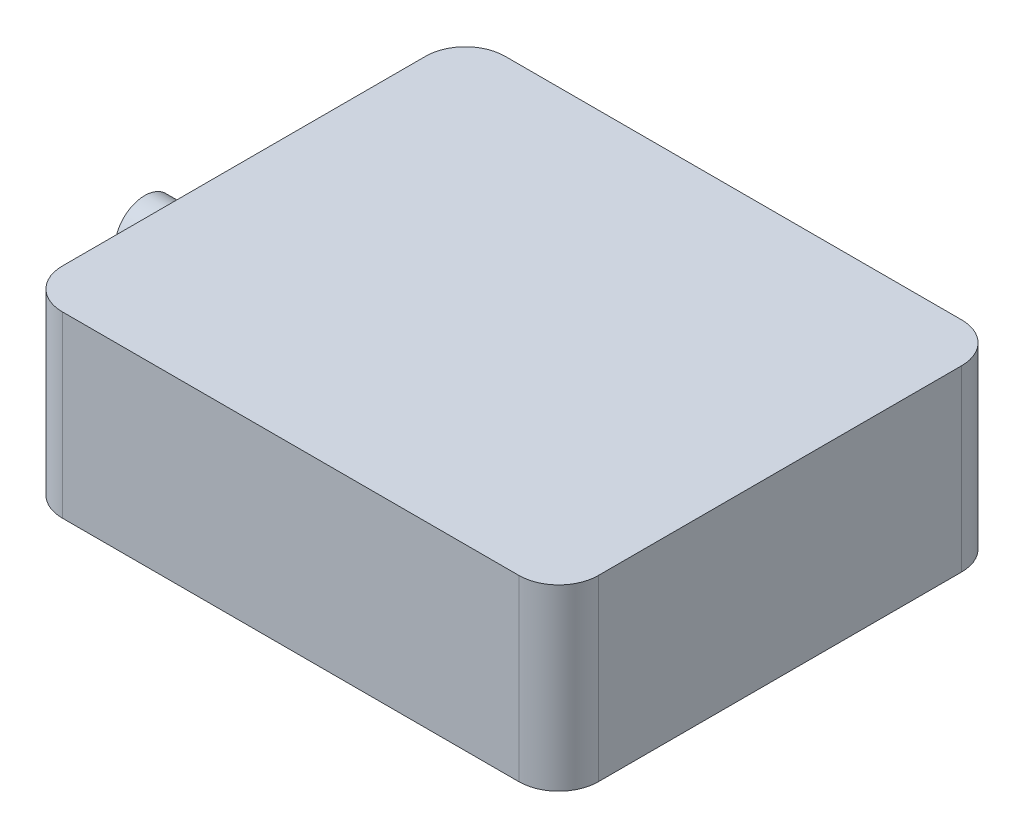
ISO-10303-21;
HEADER;
FILE_DESCRIPTION(('STEP AP214'),'2;1');
FILE_NAME('part.step','',(''),(''),'','','');
FILE_SCHEMA(('AUTOMOTIVE_DESIGN { 1 0 10303 214 1 1 1 1 }'));
ENDSEC;
DATA;
#1=APPLICATION_CONTEXT('core data for automotive mechanical design processes');
#2=APPLICATION_PROTOCOL_DEFINITION('international standard','automotive_design',2000,#1);
#3=PRODUCT_CONTEXT('',#1,'mechanical');
#4=PRODUCT('Part','Part','',(#3));
#5=PRODUCT_RELATED_PRODUCT_CATEGORY('part','',(#4));
#6=PRODUCT_DEFINITION_FORMATION('','',#4);
#7=PRODUCT_DEFINITION_CONTEXT('part definition',#1,'design');
#8=PRODUCT_DEFINITION('design','',#6,#7);
#9=PRODUCT_DEFINITION_SHAPE('','',#8);
#10=(LENGTH_UNIT() NAMED_UNIT(*) SI_UNIT(.MILLI.,.METRE.));
#11=(NAMED_UNIT(*) PLANE_ANGLE_UNIT() SI_UNIT($,.RADIAN.));
#12=(NAMED_UNIT(*) SI_UNIT($,.STERADIAN.) SOLID_ANGLE_UNIT());
#13=UNCERTAINTY_MEASURE_WITH_UNIT(LENGTH_MEASURE(1.E-05),#10,'distance_accuracy_value','');
#14=(GEOMETRIC_REPRESENTATION_CONTEXT(3) GLOBAL_UNCERTAINTY_ASSIGNED_CONTEXT((#13)) GLOBAL_UNIT_ASSIGNED_CONTEXT((#10,
#11,#12)) REPRESENTATION_CONTEXT('',''));
#15=CARTESIAN_POINT('',(0.,0.,0.));
#16=DIRECTION('',(0.,0.,1.));
#17=DIRECTION('',(1.,0.,0.));
#18=AXIS2_PLACEMENT_3D('',#15,#16,#17);
#19=CARTESIAN_POINT('',(13.5,9.,11.15));
#20=DIRECTION('',(-1.,0.,0.));
#21=DIRECTION('',(0.,0.,1.));
#22=AXIS2_PLACEMENT_3D('',#19,#20,#21);
#23=PLANE('',#22);
#24=DIRECTION('',(0.,0.,-1.));
#25=VECTOR('',#24,1.);
#26=CARTESIAN_POINT('',(13.5,0.,11.15));
#27=LINE('',#26,#25);
#28=CARTESIAN_POINT('',(13.5,0.,9.15));
#29=VERTEX_POINT('',#28);
#30=CARTESIAN_POINT('',(13.5,0.,-9.15));
#31=VERTEX_POINT('',#30);
#32=EDGE_CURVE('E142',#29,#31,#27,.T.);
#33=ORIENTED_EDGE('',*,*,#32,.T.);
#34=DIRECTION('',(0.,-1.,0.));
#35=VECTOR('',#34,1.);
#36=CARTESIAN_POINT('',(13.5,9.,-9.15));
#37=LINE('',#36,#35);
#38=CARTESIAN_POINT('',(13.5,9.,-9.15));
#39=VERTEX_POINT('',#38);
#40=EDGE_CURVE('E117',#31,#39,#37,.F.);
#41=ORIENTED_EDGE('',*,*,#40,.T.);
#42=DIRECTION('',(0.,0.,-1.));
#43=VECTOR('',#42,1.);
#44=CARTESIAN_POINT('',(13.5,9.,11.15));
#45=LINE('',#44,#43);
#46=CARTESIAN_POINT('',(13.5,9.,9.15));
#47=VERTEX_POINT('',#46);
#48=EDGE_CURVE('E155',#47,#39,#45,.T.);
#49=ORIENTED_EDGE('',*,*,#48,.F.);
#50=DIRECTION('',(0.,-1.,0.));
#51=VECTOR('',#50,1.);
#52=CARTESIAN_POINT('',(13.5,9.,9.15));
#53=LINE('',#52,#51);
#54=EDGE_CURVE('E123',#47,#29,#53,.T.);
#55=ORIENTED_EDGE('',*,*,#54,.T.);
#56=EDGE_LOOP('',(#33,#41,#49,#55));
#57=FACE_BOUND('',#56,.T.);
#58=ADVANCED_FACE('F45',(#57),#23,.F.);
#59=CARTESIAN_POINT('',(-13.5,9.,-11.15));
#60=DIRECTION('',(0.,0.,1.));
#61=DIRECTION('',(1.,0.,0.));
#62=AXIS2_PLACEMENT_3D('',#59,#60,#61);
#63=PLANE('',#62);
#64=DIRECTION('',(-1.,0.,0.));
#65=VECTOR('',#64,1.);
#66=CARTESIAN_POINT('',(-13.5,9.,-11.15));
#67=LINE('',#66,#65);
#68=CARTESIAN_POINT('',(11.5,9.,-11.15));
#69=VERTEX_POINT('',#68);
#70=CARTESIAN_POINT('',(-11.5,9.,-11.15));
#71=VERTEX_POINT('',#70);
#72=EDGE_CURVE('E133',#69,#71,#67,.T.);
#73=ORIENTED_EDGE('',*,*,#72,.F.);
#74=DIRECTION('',(0.,-1.,0.));
#75=VECTOR('',#74,1.);
#76=CARTESIAN_POINT('',(11.5,9.,-11.15));
#77=LINE('',#76,#75);
#78=CARTESIAN_POINT('',(11.5,0.,-11.15));
#79=VERTEX_POINT('',#78);
#80=EDGE_CURVE('E116',#69,#79,#77,.T.);
#81=ORIENTED_EDGE('',*,*,#80,.T.);
#82=DIRECTION('',(-1.,0.,0.));
#83=VECTOR('',#82,1.);
#84=CARTESIAN_POINT('',(-13.5,0.,-11.15));
#85=LINE('',#84,#83);
#86=CARTESIAN_POINT('',(-11.5,0.,-11.15));
#87=VERTEX_POINT('',#86);
#88=EDGE_CURVE('E130',#79,#87,#85,.T.);
#89=ORIENTED_EDGE('',*,*,#88,.T.);
#90=DIRECTION('',(0.,-1.,0.));
#91=VECTOR('',#90,1.);
#92=CARTESIAN_POINT('',(-11.5,9.,-11.15));
#93=LINE('',#92,#91);
#94=EDGE_CURVE('E136',#87,#71,#93,.F.);
#95=ORIENTED_EDGE('',*,*,#94,.T.);
#96=EDGE_LOOP('',(#73,#81,#89,#95));
#97=FACE_BOUND('',#96,.T.);
#98=ADVANCED_FACE('F129',(#97),#63,.F.);
#99=CARTESIAN_POINT('',(-13.5,9.,11.15));
#100=DIRECTION('',(1.,0.,0.));
#101=DIRECTION('',(0.,0.,-1.));
#102=AXIS2_PLACEMENT_3D('',#99,#100,#101);
#103=PLANE('',#102);
#104=CARTESIAN_POINT('',(-13.5,3.5,0.));
#105=DIRECTION('',(1.,0.,0.));
#106=DIRECTION('',(0.,0.,-1.));
#107=AXIS2_PLACEMENT_3D('',#104,#105,#106);
#108=CIRCLE('',#107,1.5);
#109=CARTESIAN_POINT('',(-13.5,3.5,-1.5));
#110=VERTEX_POINT('',#109);
#111=EDGE_CURVE('E156',#110,#110,#108,.F.);
#112=ORIENTED_EDGE('',*,*,#111,.F.);
#113=EDGE_LOOP('',(#112));
#114=FACE_BOUND('',#113,.T.);
#115=DIRECTION('',(0.,0.,1.));
#116=VECTOR('',#115,1.);
#117=CARTESIAN_POINT('',(-13.5,0.,11.15));
#118=LINE('',#117,#116);
#119=CARTESIAN_POINT('',(-13.5,0.,-9.15));
#120=VERTEX_POINT('',#119);
#121=CARTESIAN_POINT('',(-13.5,0.,9.15));
#122=VERTEX_POINT('',#121);
#123=EDGE_CURVE('E141',#120,#122,#118,.T.);
#124=ORIENTED_EDGE('',*,*,#123,.T.);
#125=DIRECTION('',(0.,-1.,0.));
#126=VECTOR('',#125,1.);
#127=CARTESIAN_POINT('',(-13.5,9.,9.15));
#128=LINE('',#127,#126);
#129=CARTESIAN_POINT('',(-13.5,9.,9.15));
#130=VERTEX_POINT('',#129);
#131=EDGE_CURVE('E11',#122,#130,#128,.F.);
#132=ORIENTED_EDGE('',*,*,#131,.T.);
#133=DIRECTION('',(0.,0.,1.));
#134=VECTOR('',#133,1.);
#135=CARTESIAN_POINT('',(-13.5,9.,11.15));
#136=LINE('',#135,#134);
#137=CARTESIAN_POINT('',(-13.5,9.,-9.15));
#138=VERTEX_POINT('',#137);
#139=EDGE_CURVE('E198',#138,#130,#136,.T.);
#140=ORIENTED_EDGE('',*,*,#139,.F.);
#141=DIRECTION('',(0.,-1.,0.));
#142=VECTOR('',#141,1.);
#143=CARTESIAN_POINT('',(-13.5,9.,-9.15));
#144=LINE('',#143,#142);
#145=EDGE_CURVE('E54',#138,#120,#144,.T.);
#146=ORIENTED_EDGE('',*,*,#145,.T.);
#147=EDGE_LOOP('',(#124,#132,#140,#146));
#148=FACE_BOUND('',#147,.T.);
#149=ADVANCED_FACE('F196',(#114,#148),#103,.F.);
#150=CARTESIAN_POINT('',(-13.5,9.,11.15));
#151=DIRECTION('',(0.,0.,-1.));
#152=DIRECTION('',(-1.,0.,0.));
#153=AXIS2_PLACEMENT_3D('',#150,#151,#152);
#154=PLANE('',#153);
#155=DIRECTION('',(1.,0.,0.));
#156=VECTOR('',#155,1.);
#157=CARTESIAN_POINT('',(-13.5,0.,11.15));
#158=LINE('',#157,#156);
#159=CARTESIAN_POINT('',(-11.5,0.,11.15));
#160=VERTEX_POINT('',#159);
#161=CARTESIAN_POINT('',(11.5,0.,11.15));
#162=VERTEX_POINT('',#161);
#163=EDGE_CURVE('E147',#160,#162,#158,.T.);
#164=ORIENTED_EDGE('',*,*,#163,.T.);
#165=DIRECTION('',(0.,-1.,0.));
#166=VECTOR('',#165,1.);
#167=CARTESIAN_POINT('',(11.5,9.,11.15));
#168=LINE('',#167,#166);
#169=CARTESIAN_POINT('',(11.5,9.,11.15));
#170=VERTEX_POINT('',#169);
#171=EDGE_CURVE('E61',#162,#170,#168,.F.);
#172=ORIENTED_EDGE('',*,*,#171,.T.);
#173=DIRECTION('',(1.,0.,0.));
#174=VECTOR('',#173,1.);
#175=CARTESIAN_POINT('',(-13.5,9.,11.15));
#176=LINE('',#175,#174);
#177=CARTESIAN_POINT('',(-11.5,9.,11.15));
#178=VERTEX_POINT('',#177);
#179=EDGE_CURVE('E160',#178,#170,#176,.T.);
#180=ORIENTED_EDGE('',*,*,#179,.F.);
#181=DIRECTION('',(0.,-1.,0.));
#182=VECTOR('',#181,1.);
#183=CARTESIAN_POINT('',(-11.5,9.,11.15));
#184=LINE('',#183,#182);
#185=EDGE_CURVE('E186',#178,#160,#184,.T.);
#186=ORIENTED_EDGE('',*,*,#185,.T.);
#187=EDGE_LOOP('',(#164,#172,#180,#186));
#188=FACE_BOUND('',#187,.T.);
#189=ADVANCED_FACE('F205',(#188),#154,.F.);
#190=CARTESIAN_POINT('',(0.,9.,0.));
#191=DIRECTION('',(0.,-1.,0.));
#192=DIRECTION('',(0.,0.,-1.));
#193=AXIS2_PLACEMENT_3D('',#190,#191,#192);
#194=PLANE('',#193);
#195=ORIENTED_EDGE('',*,*,#48,.T.);
#196=CARTESIAN_POINT('',(11.5,9.,-9.15));
#197=DIRECTION('',(0.,-1.,0.));
#198=DIRECTION('',(0.,0.,-1.));
#199=AXIS2_PLACEMENT_3D('',#196,#197,#198);
#200=CIRCLE('',#199,2.);
#201=EDGE_CURVE('E183',#39,#69,#200,.F.);
#202=ORIENTED_EDGE('',*,*,#201,.T.);
#203=ORIENTED_EDGE('',*,*,#72,.T.);
#204=CARTESIAN_POINT('',(-11.5,9.,-9.15));
#205=DIRECTION('',(0.,-1.,0.));
#206=DIRECTION('',(0.,0.,-1.));
#207=AXIS2_PLACEMENT_3D('',#204,#205,#206);
#208=CIRCLE('',#207,2.);
#209=EDGE_CURVE('E175',#71,#138,#208,.F.);
#210=ORIENTED_EDGE('',*,*,#209,.T.);
#211=ORIENTED_EDGE('',*,*,#139,.T.);
#212=CARTESIAN_POINT('',(-11.5,9.,9.15));
#213=DIRECTION('',(0.,-1.,0.));
#214=DIRECTION('',(0.,0.,-1.));
#215=AXIS2_PLACEMENT_3D('',#212,#213,#214);
#216=CIRCLE('',#215,2.);
#217=EDGE_CURVE('E68',#130,#178,#216,.F.);
#218=ORIENTED_EDGE('',*,*,#217,.T.);
#219=ORIENTED_EDGE('',*,*,#179,.T.);
#220=CARTESIAN_POINT('',(11.5,9.,9.15));
#221=DIRECTION('',(0.,-1.,0.));
#222=DIRECTION('',(0.,0.,-1.));
#223=AXIS2_PLACEMENT_3D('',#220,#221,#222);
#224=CIRCLE('',#223,2.);
#225=EDGE_CURVE('E180',#170,#47,#224,.F.);
#226=ORIENTED_EDGE('',*,*,#225,.T.);
#227=EDGE_LOOP('',(#195,#202,#203,#210,#211,#218,#219,#226));
#228=FACE_BOUND('',#227,.T.);
#229=ADVANCED_FACE('F234',(#228),#194,.F.);
#230=CARTESIAN_POINT('',(0.,0.,0.));
#231=DIRECTION('',(0.,-1.,0.));
#232=DIRECTION('',(0.,0.,-1.));
#233=AXIS2_PLACEMENT_3D('',#230,#231,#232);
#234=PLANE('',#233);
#235=ORIENTED_EDGE('',*,*,#88,.F.);
#236=CARTESIAN_POINT('',(11.5,0.,-9.15));
#237=DIRECTION('',(0.,-1.,0.));
#238=DIRECTION('',(0.,0.,-1.));
#239=AXIS2_PLACEMENT_3D('',#236,#237,#238);
#240=CIRCLE('',#239,2.);
#241=EDGE_CURVE('E112',#79,#31,#240,.T.);
#242=ORIENTED_EDGE('',*,*,#241,.T.);
#243=ORIENTED_EDGE('',*,*,#32,.F.);
#244=CARTESIAN_POINT('',(11.5,0.,9.15));
#245=DIRECTION('',(0.,-1.,0.));
#246=DIRECTION('',(0.,0.,-1.));
#247=AXIS2_PLACEMENT_3D('',#244,#245,#246);
#248=CIRCLE('',#247,2.);
#249=EDGE_CURVE('E124',#29,#162,#248,.T.);
#250=ORIENTED_EDGE('',*,*,#249,.T.);
#251=ORIENTED_EDGE('',*,*,#163,.F.);
#252=CARTESIAN_POINT('',(-11.5,0.,9.15));
#253=DIRECTION('',(0.,-1.,0.));
#254=DIRECTION('',(0.,0.,-1.));
#255=AXIS2_PLACEMENT_3D('',#252,#253,#254);
#256=CIRCLE('',#255,2.);
#257=EDGE_CURVE('E165',#160,#122,#256,.T.);
#258=ORIENTED_EDGE('',*,*,#257,.T.);
#259=ORIENTED_EDGE('',*,*,#123,.F.);
#260=CARTESIAN_POINT('',(-11.5,0.,-9.15));
#261=DIRECTION('',(0.,-1.,0.));
#262=DIRECTION('',(0.,0.,-1.));
#263=AXIS2_PLACEMENT_3D('',#260,#261,#262);
#264=CIRCLE('',#263,2.);
#265=EDGE_CURVE('E135',#120,#87,#264,.T.);
#266=ORIENTED_EDGE('',*,*,#265,.T.);
#267=EDGE_LOOP('',(#235,#242,#243,#250,#251,#258,#259,#266));
#268=FACE_BOUND('',#267,.T.);
#269=ADVANCED_FACE('F138',(#268),#234,.T.);
#270=CARTESIAN_POINT('',(-18.5,3.5,0.));
#271=DIRECTION('',(1.,0.,0.));
#272=DIRECTION('',(0.,0.,-1.));
#273=AXIS2_PLACEMENT_3D('',#270,#271,#272);
#274=CYLINDRICAL_SURFACE('',#273,1.5);
#275=CARTESIAN_POINT('',(-18.5,3.5,0.));
#276=DIRECTION('',(-1.,0.,0.));
#277=DIRECTION('',(0.,0.,1.));
#278=AXIS2_PLACEMENT_3D('',#275,#276,#277);
#279=CIRCLE('',#278,1.5);
#280=CARTESIAN_POINT('',(-18.5,3.5,1.5));
#281=VERTEX_POINT('',#280);
#282=EDGE_CURVE('E149',#281,#281,#279,.T.);
#283=ORIENTED_EDGE('',*,*,#282,.F.);
#284=EDGE_LOOP('',(#283));
#285=FACE_BOUND('',#284,.T.);
#286=ORIENTED_EDGE('',*,*,#111,.T.);
#287=EDGE_LOOP('',(#286));
#288=FACE_BOUND('',#287,.T.);
#289=ADVANCED_FACE('F222',(#285,#288),#274,.T.);
#290=CARTESIAN_POINT('',(-18.5,3.5,0.));
#291=DIRECTION('',(-1.,0.,0.));
#292=DIRECTION('',(0.,0.,1.));
#293=AXIS2_PLACEMENT_3D('',#290,#291,#292);
#294=PLANE('',#293);
#295=ORIENTED_EDGE('',*,*,#282,.T.);
#296=EDGE_LOOP('',(#295));
#297=FACE_BOUND('',#296,.T.);
#298=ADVANCED_FACE('F220',(#297),#294,.T.);
#299=CARTESIAN_POINT('',(11.5,9.,-9.15));
#300=DIRECTION('',(0.,-1.,0.));
#301=DIRECTION('',(0.,0.,-1.));
#302=AXIS2_PLACEMENT_3D('',#299,#300,#301);
#303=CYLINDRICAL_SURFACE('',#302,2.);
#304=ORIENTED_EDGE('',*,*,#201,.F.);
#305=ORIENTED_EDGE('',*,*,#40,.F.);
#306=ORIENTED_EDGE('',*,*,#241,.F.);
#307=ORIENTED_EDGE('',*,*,#80,.F.);
#308=EDGE_LOOP('',(#304,#305,#306,#307));
#309=FACE_BOUND('',#308,.T.);
#310=ADVANCED_FACE('F115',(#309),#303,.T.);
#311=CARTESIAN_POINT('',(11.5,9.,9.15));
#312=DIRECTION('',(0.,-1.,0.));
#313=DIRECTION('',(0.,0.,-1.));
#314=AXIS2_PLACEMENT_3D('',#311,#312,#313);
#315=CYLINDRICAL_SURFACE('',#314,2.);
#316=ORIENTED_EDGE('',*,*,#225,.F.);
#317=ORIENTED_EDGE('',*,*,#171,.F.);
#318=ORIENTED_EDGE('',*,*,#249,.F.);
#319=ORIENTED_EDGE('',*,*,#54,.F.);
#320=EDGE_LOOP('',(#316,#317,#318,#319));
#321=FACE_BOUND('',#320,.T.);
#322=ADVANCED_FACE('F246',(#321),#315,.T.);
#323=CARTESIAN_POINT('',(-11.5,9.,9.15));
#324=DIRECTION('',(0.,-1.,0.));
#325=DIRECTION('',(0.,0.,-1.));
#326=AXIS2_PLACEMENT_3D('',#323,#324,#325);
#327=CYLINDRICAL_SURFACE('',#326,2.);
#328=ORIENTED_EDGE('',*,*,#217,.F.);
#329=ORIENTED_EDGE('',*,*,#131,.F.);
#330=ORIENTED_EDGE('',*,*,#257,.F.);
#331=ORIENTED_EDGE('',*,*,#185,.F.);
#332=EDGE_LOOP('',(#328,#329,#330,#331));
#333=FACE_BOUND('',#332,.T.);
#334=ADVANCED_FACE('F204',(#333),#327,.T.);
#335=CARTESIAN_POINT('',(-11.5,9.,-9.15));
#336=DIRECTION('',(0.,-1.,0.));
#337=DIRECTION('',(0.,0.,-1.));
#338=AXIS2_PLACEMENT_3D('',#335,#336,#337);
#339=CYLINDRICAL_SURFACE('',#338,2.);
#340=ORIENTED_EDGE('',*,*,#209,.F.);
#341=ORIENTED_EDGE('',*,*,#94,.F.);
#342=ORIENTED_EDGE('',*,*,#265,.F.);
#343=ORIENTED_EDGE('',*,*,#145,.F.);
#344=EDGE_LOOP('',(#340,#341,#342,#343));
#345=FACE_BOUND('',#344,.T.);
#346=ADVANCED_FACE('F47',(#345),#339,.T.);
#347=CLOSED_SHELL('',(#58,#98,#149,#189,#229,#269,#289,#298,#310,#322,#334,#346));
#348=MANIFOLD_SOLID_BREP('B2',#347);
#349=ADVANCED_BREP_SHAPE_REPRESENTATION('',(#18,#348),#14);
#350=SHAPE_DEFINITION_REPRESENTATION(#9,#349);
ENDSEC;
END-ISO-10303-21;
